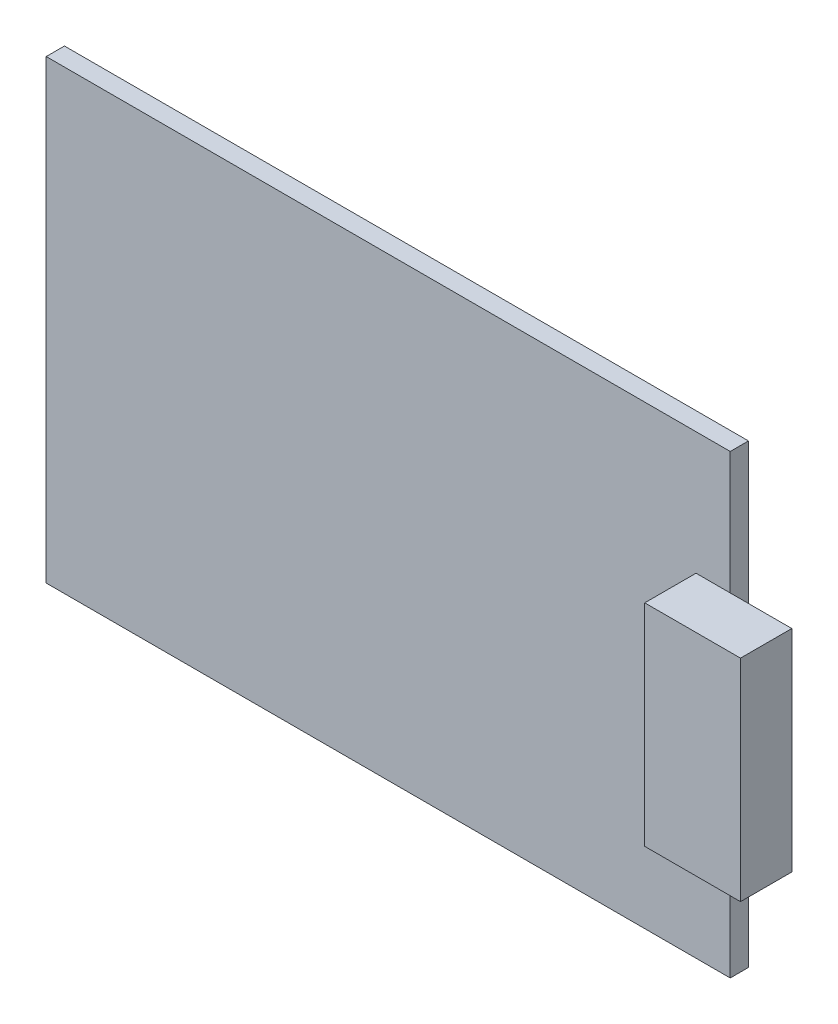
ISO-10303-21;
HEADER;
FILE_DESCRIPTION(('STEP AP214'),'2;1');
FILE_NAME('part.step','',(''),(''),'','','');
FILE_SCHEMA(('AUTOMOTIVE_DESIGN { 1 0 10303 214 1 1 1 1 }'));
ENDSEC;
DATA;
#1=APPLICATION_CONTEXT('core data for automotive mechanical design processes');
#2=APPLICATION_PROTOCOL_DEFINITION('international standard','automotive_design',2000,#1);
#3=PRODUCT_CONTEXT('',#1,'mechanical');
#4=PRODUCT('Part','Part','',(#3));
#5=PRODUCT_RELATED_PRODUCT_CATEGORY('part','',(#4));
#6=PRODUCT_DEFINITION_FORMATION('','',#4);
#7=PRODUCT_DEFINITION_CONTEXT('part definition',#1,'design');
#8=PRODUCT_DEFINITION('design','',#6,#7);
#9=PRODUCT_DEFINITION_SHAPE('','',#8);
#10=(LENGTH_UNIT() NAMED_UNIT(*) SI_UNIT(.MILLI.,.METRE.));
#11=(NAMED_UNIT(*) PLANE_ANGLE_UNIT() SI_UNIT($,.RADIAN.));
#12=(NAMED_UNIT(*) SI_UNIT($,.STERADIAN.) SOLID_ANGLE_UNIT());
#13=UNCERTAINTY_MEASURE_WITH_UNIT(LENGTH_MEASURE(1.E-05),#10,'distance_accuracy_value','');
#14=(GEOMETRIC_REPRESENTATION_CONTEXT(3) GLOBAL_UNCERTAINTY_ASSIGNED_CONTEXT((#13)) GLOBAL_UNIT_ASSIGNED_CONTEXT((#10,
#11,#12)) REPRESENTATION_CONTEXT('',''));
#15=CARTESIAN_POINT('',(0.,0.,0.));
#16=DIRECTION('',(0.,0.,1.));
#17=DIRECTION('',(1.,0.,0.));
#18=AXIS2_PLACEMENT_3D('',#15,#16,#17);
#19=CARTESIAN_POINT('',(0.,0.,1.6));
#20=DIRECTION('',(0.,0.,1.));
#21=DIRECTION('',(1.,0.,0.));
#22=AXIS2_PLACEMENT_3D('',#19,#20,#21);
#23=PLANE('',#22);
#24=DIRECTION('',(0.,1.,0.));
#25=VECTOR('',#24,1.);
#26=CARTESIAN_POINT('',(27.,-9.25,1.6));
#27=LINE('',#26,#25);
#28=CARTESIAN_POINT('',(27.,-9.25,1.6));
#29=VERTEX_POINT('',#28);
#30=CARTESIAN_POINT('',(27.,9.25,1.6));
#31=VERTEX_POINT('',#30);
#32=EDGE_CURVE('E169',#29,#31,#27,.T.);
#33=ORIENTED_EDGE('',*,*,#32,.T.);
#34=DIRECTION('',(1.,0.,0.));
#35=VECTOR('',#34,1.);
#36=CARTESIAN_POINT('',(27.,9.25,1.6));
#37=LINE('',#36,#35);
#38=CARTESIAN_POINT('',(30.,9.25,1.6));
#39=VERTEX_POINT('',#38);
#40=EDGE_CURVE('E185',#31,#39,#37,.T.);
#41=ORIENTED_EDGE('',*,*,#40,.T.);
#42=DIRECTION('',(0.,1.,0.));
#43=VECTOR('',#42,1.);
#44=CARTESIAN_POINT('',(30.,20.,1.6));
#45=LINE('',#44,#43);
#46=CARTESIAN_POINT('',(30.,20.,1.6));
#47=VERTEX_POINT('',#46);
#48=EDGE_CURVE('E193',#39,#47,#45,.T.);
#49=ORIENTED_EDGE('',*,*,#48,.T.);
#50=DIRECTION('',(-1.,0.,0.));
#51=VECTOR('',#50,1.);
#52=CARTESIAN_POINT('',(30.,20.,1.6));
#53=LINE('',#52,#51);
#54=CARTESIAN_POINT('',(-30.,20.,1.6));
#55=VERTEX_POINT('',#54);
#56=EDGE_CURVE('E196',#47,#55,#53,.T.);
#57=ORIENTED_EDGE('',*,*,#56,.T.);
#58=DIRECTION('',(0.,-1.,0.));
#59=VECTOR('',#58,1.);
#60=CARTESIAN_POINT('',(-30.,20.,1.6));
#61=LINE('',#60,#59);
#62=CARTESIAN_POINT('',(-30.,-20.,1.6));
#63=VERTEX_POINT('',#62);
#64=EDGE_CURVE('E74',#55,#63,#61,.T.);
#65=ORIENTED_EDGE('',*,*,#64,.T.);
#66=DIRECTION('',(1.,0.,0.));
#67=VECTOR('',#66,1.);
#68=CARTESIAN_POINT('',(30.,-20.,1.6));
#69=LINE('',#68,#67);
#70=CARTESIAN_POINT('',(30.,-20.,1.6));
#71=VERTEX_POINT('',#70);
#72=EDGE_CURVE('E190',#63,#71,#69,.T.);
#73=ORIENTED_EDGE('',*,*,#72,.T.);
#74=CARTESIAN_POINT('',(30.,-9.25,1.6));
#75=VERTEX_POINT('',#74);
#76=EDGE_CURVE('E102',#71,#75,#45,.T.);
#77=ORIENTED_EDGE('',*,*,#76,.T.);
#78=DIRECTION('',(1.,0.,0.));
#79=VECTOR('',#78,1.);
#80=CARTESIAN_POINT('',(27.,-9.25,1.6));
#81=LINE('',#80,#79);
#82=EDGE_CURVE('E139',#29,#75,#81,.T.);
#83=ORIENTED_EDGE('',*,*,#82,.F.);
#84=EDGE_LOOP('',(#33,#41,#49,#57,#65,#73,#77,#83));
#85=FACE_BOUND('',#84,.T.);
#86=ADVANCED_FACE('F49',(#85),#23,.T.);
#87=CARTESIAN_POINT('',(30.,-20.,1.6));
#88=DIRECTION('',(0.,1.,0.));
#89=DIRECTION('',(0.,0.,1.));
#90=AXIS2_PLACEMENT_3D('',#87,#88,#89);
#91=PLANE('',#90);
#92=DIRECTION('',(1.,0.,0.));
#93=VECTOR('',#92,1.);
#94=CARTESIAN_POINT('',(30.,-20.,0.));
#95=LINE('',#94,#93);
#96=CARTESIAN_POINT('',(-30.,-20.,0.));
#97=VERTEX_POINT('',#96);
#98=CARTESIAN_POINT('',(30.,-20.,0.));
#99=VERTEX_POINT('',#98);
#100=EDGE_CURVE('E181',#97,#99,#95,.T.);
#101=ORIENTED_EDGE('',*,*,#100,.T.);
#102=DIRECTION('',(0.,0.,-1.));
#103=VECTOR('',#102,1.);
#104=CARTESIAN_POINT('',(30.,-20.,1.6));
#105=LINE('',#104,#103);
#106=EDGE_CURVE('E11',#71,#99,#105,.T.);
#107=ORIENTED_EDGE('',*,*,#106,.F.);
#108=ORIENTED_EDGE('',*,*,#72,.F.);
#109=DIRECTION('',(0.,0.,-1.));
#110=VECTOR('',#109,1.);
#111=CARTESIAN_POINT('',(-30.,-20.,1.6));
#112=LINE('',#111,#110);
#113=EDGE_CURVE('E202',#63,#97,#112,.T.);
#114=ORIENTED_EDGE('',*,*,#113,.T.);
#115=EDGE_LOOP('',(#101,#107,#108,#114));
#116=FACE_BOUND('',#115,.T.);
#117=ADVANCED_FACE('F51',(#116),#91,.F.);
#118=CARTESIAN_POINT('',(30.,20.,1.6));
#119=DIRECTION('',(-1.,0.,0.));
#120=DIRECTION('',(0.,0.,1.));
#121=AXIS2_PLACEMENT_3D('',#118,#119,#120);
#122=PLANE('',#121);
#123=DIRECTION('',(0.,1.,0.));
#124=VECTOR('',#123,1.);
#125=CARTESIAN_POINT('',(30.,20.,0.));
#126=LINE('',#125,#124);
#127=CARTESIAN_POINT('',(30.,20.,0.));
#128=VERTEX_POINT('',#127);
#129=EDGE_CURVE('E206',#99,#128,#126,.T.);
#130=ORIENTED_EDGE('',*,*,#129,.T.);
#131=DIRECTION('',(0.,0.,-1.));
#132=VECTOR('',#131,1.);
#133=CARTESIAN_POINT('',(30.,20.,1.6));
#134=LINE('',#133,#132);
#135=EDGE_CURVE('E58',#47,#128,#134,.T.);
#136=ORIENTED_EDGE('',*,*,#135,.F.);
#137=ORIENTED_EDGE('',*,*,#48,.F.);
#138=EDGE_CURVE('E197',#75,#39,#45,.T.);
#139=ORIENTED_EDGE('',*,*,#138,.F.);
#140=ORIENTED_EDGE('',*,*,#76,.F.);
#141=ORIENTED_EDGE('',*,*,#106,.T.);
#142=EDGE_LOOP('',(#130,#136,#137,#139,#140,#141));
#143=FACE_BOUND('',#142,.T.);
#144=ADVANCED_FACE('F241',(#143),#122,.F.);
#145=CARTESIAN_POINT('',(30.,20.,1.6));
#146=DIRECTION('',(0.,-1.,0.));
#147=DIRECTION('',(0.,0.,-1.));
#148=AXIS2_PLACEMENT_3D('',#145,#146,#147);
#149=PLANE('',#148);
#150=DIRECTION('',(-1.,0.,0.));
#151=VECTOR('',#150,1.);
#152=CARTESIAN_POINT('',(30.,20.,0.));
#153=LINE('',#152,#151);
#154=CARTESIAN_POINT('',(-30.,20.,0.));
#155=VERTEX_POINT('',#154);
#156=EDGE_CURVE('E209',#128,#155,#153,.T.);
#157=ORIENTED_EDGE('',*,*,#156,.T.);
#158=DIRECTION('',(0.,0.,-1.));
#159=VECTOR('',#158,1.);
#160=CARTESIAN_POINT('',(-30.,20.,1.6));
#161=LINE('',#160,#159);
#162=EDGE_CURVE('E216',#55,#155,#161,.T.);
#163=ORIENTED_EDGE('',*,*,#162,.F.);
#164=ORIENTED_EDGE('',*,*,#56,.F.);
#165=ORIENTED_EDGE('',*,*,#135,.T.);
#166=EDGE_LOOP('',(#157,#163,#164,#165));
#167=FACE_BOUND('',#166,.T.);
#168=ADVANCED_FACE('F224',(#167),#149,.F.);
#169=CARTESIAN_POINT('',(-30.,20.,1.6));
#170=DIRECTION('',(1.,0.,0.));
#171=DIRECTION('',(0.,0.,-1.));
#172=AXIS2_PLACEMENT_3D('',#169,#170,#171);
#173=PLANE('',#172);
#174=DIRECTION('',(0.,-1.,0.));
#175=VECTOR('',#174,1.);
#176=CARTESIAN_POINT('',(-30.,20.,0.));
#177=LINE('',#176,#175);
#178=EDGE_CURVE('E95',#155,#97,#177,.T.);
#179=ORIENTED_EDGE('',*,*,#178,.T.);
#180=ORIENTED_EDGE('',*,*,#113,.F.);
#181=ORIENTED_EDGE('',*,*,#64,.F.);
#182=ORIENTED_EDGE('',*,*,#162,.T.);
#183=EDGE_LOOP('',(#179,#180,#181,#182));
#184=FACE_BOUND('',#183,.T.);
#185=ADVANCED_FACE('F233',(#184),#173,.F.);
#186=CARTESIAN_POINT('',(0.,0.,0.));
#187=DIRECTION('',(0.,0.,1.));
#188=DIRECTION('',(1.,0.,0.));
#189=AXIS2_PLACEMENT_3D('',#186,#187,#188);
#190=PLANE('',#189);
#191=ORIENTED_EDGE('',*,*,#100,.F.);
#192=ORIENTED_EDGE('',*,*,#178,.F.);
#193=ORIENTED_EDGE('',*,*,#156,.F.);
#194=ORIENTED_EDGE('',*,*,#129,.F.);
#195=EDGE_LOOP('',(#191,#192,#193,#194));
#196=FACE_BOUND('',#195,.T.);
#197=ADVANCED_FACE('F229',(#196),#190,.F.);
#198=CARTESIAN_POINT('',(27.,-9.25,1.6));
#199=DIRECTION('',(0.,-1.,0.));
#200=DIRECTION('',(0.,0.,-1.));
#201=AXIS2_PLACEMENT_3D('',#198,#199,#200);
#202=PLANE('',#201);
#203=ORIENTED_EDGE('',*,*,#82,.T.);
#204=CARTESIAN_POINT('',(35.4,-9.25,1.6));
#205=VERTEX_POINT('',#204);
#206=EDGE_CURVE('E132',#75,#205,#81,.T.);
#207=ORIENTED_EDGE('',*,*,#206,.T.);
#208=DIRECTION('',(0.,0.,-1.));
#209=VECTOR('',#208,1.);
#210=CARTESIAN_POINT('',(35.4,-9.25,1.6));
#211=LINE('',#210,#209);
#212=CARTESIAN_POINT('',(35.4,-9.25,6.1));
#213=VERTEX_POINT('',#212);
#214=EDGE_CURVE('E136',#213,#205,#211,.T.);
#215=ORIENTED_EDGE('',*,*,#214,.F.);
#216=DIRECTION('',(1.,0.,0.));
#217=VECTOR('',#216,1.);
#218=CARTESIAN_POINT('',(27.,-9.25,6.1));
#219=LINE('',#218,#217);
#220=CARTESIAN_POINT('',(27.,-9.25,6.1));
#221=VERTEX_POINT('',#220);
#222=EDGE_CURVE('E178',#221,#213,#219,.T.);
#223=ORIENTED_EDGE('',*,*,#222,.F.);
#224=DIRECTION('',(0.,0.,-1.));
#225=VECTOR('',#224,1.);
#226=CARTESIAN_POINT('',(27.,-9.25,1.6));
#227=LINE('',#226,#225);
#228=EDGE_CURVE('E166',#221,#29,#227,.T.);
#229=ORIENTED_EDGE('',*,*,#228,.T.);
#230=EDGE_LOOP('',(#203,#207,#215,#223,#229));
#231=FACE_BOUND('',#230,.T.);
#232=ADVANCED_FACE('F134',(#231),#202,.T.);
#233=CARTESIAN_POINT('',(27.,-9.25,6.1));
#234=DIRECTION('',(0.,0.,1.));
#235=DIRECTION('',(1.,0.,0.));
#236=AXIS2_PLACEMENT_3D('',#233,#234,#235);
#237=PLANE('',#236);
#238=ORIENTED_EDGE('',*,*,#222,.T.);
#239=DIRECTION('',(0.,-1.,0.));
#240=VECTOR('',#239,1.);
#241=CARTESIAN_POINT('',(35.4,-9.25,6.1));
#242=LINE('',#241,#240);
#243=CARTESIAN_POINT('',(35.4,9.25,6.1));
#244=VERTEX_POINT('',#243);
#245=EDGE_CURVE('E158',#244,#213,#242,.T.);
#246=ORIENTED_EDGE('',*,*,#245,.F.);
#247=DIRECTION('',(1.,0.,0.));
#248=VECTOR('',#247,1.);
#249=CARTESIAN_POINT('',(27.,9.25,6.1));
#250=LINE('',#249,#248);
#251=CARTESIAN_POINT('',(27.,9.25,6.1));
#252=VERTEX_POINT('',#251);
#253=EDGE_CURVE('E182',#252,#244,#250,.T.);
#254=ORIENTED_EDGE('',*,*,#253,.F.);
#255=DIRECTION('',(0.,-1.,0.));
#256=VECTOR('',#255,1.);
#257=CARTESIAN_POINT('',(27.,-9.25,6.1));
#258=LINE('',#257,#256);
#259=EDGE_CURVE('E142',#252,#221,#258,.T.);
#260=ORIENTED_EDGE('',*,*,#259,.T.);
#261=EDGE_LOOP('',(#238,#246,#254,#260));
#262=FACE_BOUND('',#261,.T.);
#263=ADVANCED_FACE('F251',(#262),#237,.T.);
#264=CARTESIAN_POINT('',(27.,9.25,1.6));
#265=DIRECTION('',(0.,1.,0.));
#266=DIRECTION('',(0.,0.,1.));
#267=AXIS2_PLACEMENT_3D('',#264,#265,#266);
#268=PLANE('',#267);
#269=ORIENTED_EDGE('',*,*,#253,.T.);
#270=DIRECTION('',(0.,0.,1.));
#271=VECTOR('',#270,1.);
#272=CARTESIAN_POINT('',(35.4,9.25,1.6));
#273=LINE('',#272,#271);
#274=CARTESIAN_POINT('',(35.4,9.25,1.6));
#275=VERTEX_POINT('',#274);
#276=EDGE_CURVE('E153',#275,#244,#273,.T.);
#277=ORIENTED_EDGE('',*,*,#276,.F.);
#278=EDGE_CURVE('E148',#39,#275,#37,.T.);
#279=ORIENTED_EDGE('',*,*,#278,.F.);
#280=ORIENTED_EDGE('',*,*,#40,.F.);
#281=DIRECTION('',(0.,0.,1.));
#282=VECTOR('',#281,1.);
#283=CARTESIAN_POINT('',(27.,9.25,1.6));
#284=LINE('',#283,#282);
#285=EDGE_CURVE('E65',#31,#252,#284,.T.);
#286=ORIENTED_EDGE('',*,*,#285,.T.);
#287=EDGE_LOOP('',(#269,#277,#279,#280,#286));
#288=FACE_BOUND('',#287,.T.);
#289=ADVANCED_FACE('F255',(#288),#268,.T.);
#290=CARTESIAN_POINT('',(27.,-9.25,1.6));
#291=DIRECTION('',(0.,0.,-1.));
#292=DIRECTION('',(-1.,0.,0.));
#293=AXIS2_PLACEMENT_3D('',#290,#291,#292);
#294=PLANE('',#293);
#295=ORIENTED_EDGE('',*,*,#206,.F.);
#296=ORIENTED_EDGE('',*,*,#138,.T.);
#297=ORIENTED_EDGE('',*,*,#278,.T.);
#298=DIRECTION('',(0.,1.,0.));
#299=VECTOR('',#298,1.);
#300=CARTESIAN_POINT('',(35.4,-9.25,1.6));
#301=LINE('',#300,#299);
#302=EDGE_CURVE('E145',#205,#275,#301,.T.);
#303=ORIENTED_EDGE('',*,*,#302,.F.);
#304=EDGE_LOOP('',(#295,#296,#297,#303));
#305=FACE_BOUND('',#304,.T.);
#306=ADVANCED_FACE('F146',(#305),#294,.T.);
#307=CARTESIAN_POINT('',(27.,0.,0.));
#308=DIRECTION('',(-1.,0.,0.));
#309=DIRECTION('',(0.,0.,1.));
#310=AXIS2_PLACEMENT_3D('',#307,#308,#309);
#311=PLANE('',#310);
#312=ORIENTED_EDGE('',*,*,#228,.F.);
#313=ORIENTED_EDGE('',*,*,#259,.F.);
#314=ORIENTED_EDGE('',*,*,#285,.F.);
#315=ORIENTED_EDGE('',*,*,#32,.F.);
#316=EDGE_LOOP('',(#312,#313,#314,#315));
#317=FACE_BOUND('',#316,.T.);
#318=ADVANCED_FACE('F254',(#317),#311,.T.);
#319=CARTESIAN_POINT('',(35.4,0.,0.));
#320=DIRECTION('',(-1.,0.,0.));
#321=DIRECTION('',(0.,0.,1.));
#322=AXIS2_PLACEMENT_3D('',#319,#320,#321);
#323=PLANE('',#322);
#324=ORIENTED_EDGE('',*,*,#214,.T.);
#325=ORIENTED_EDGE('',*,*,#302,.T.);
#326=ORIENTED_EDGE('',*,*,#276,.T.);
#327=ORIENTED_EDGE('',*,*,#245,.T.);
#328=EDGE_LOOP('',(#324,#325,#326,#327));
#329=FACE_BOUND('',#328,.T.);
#330=ADVANCED_FACE('F156',(#329),#323,.F.);
#331=CLOSED_SHELL('',(#86,#117,#144,#168,#185,#197,#232,#263,#289,#306,#318,#330));
#332=MANIFOLD_SOLID_BREP('B2',#331);
#333=ADVANCED_BREP_SHAPE_REPRESENTATION('',(#18,#332),#14);
#334=SHAPE_DEFINITION_REPRESENTATION(#9,#333);
ENDSEC;
END-ISO-10303-21;
